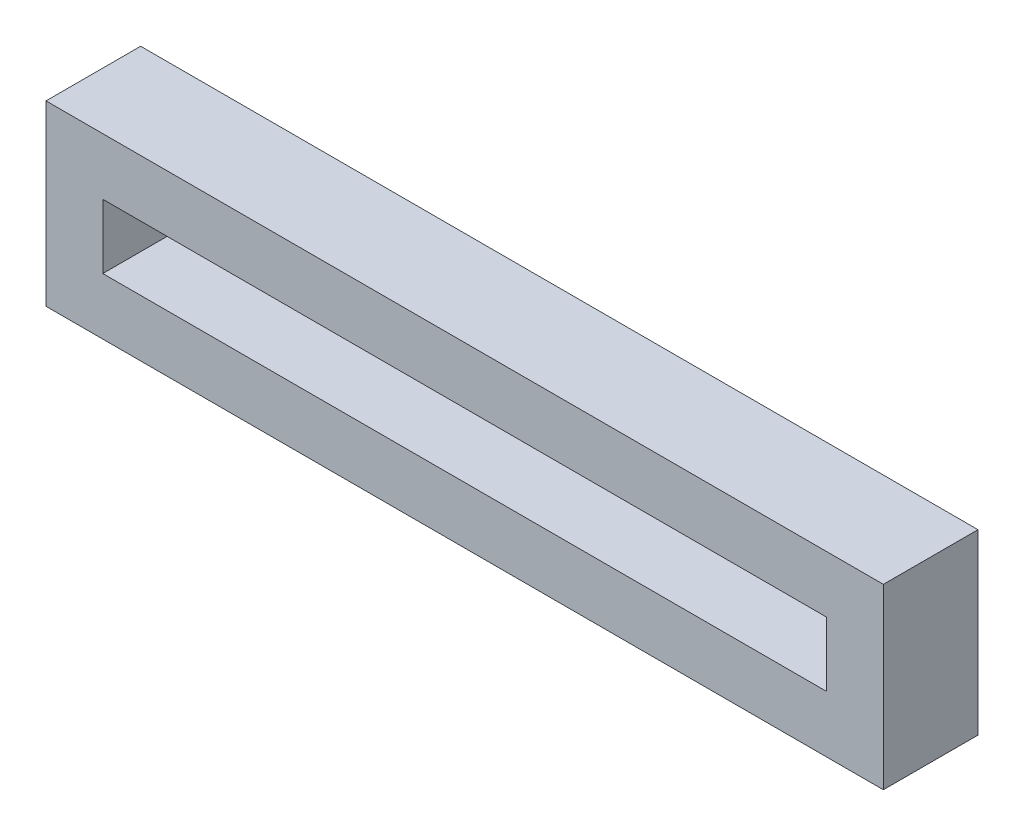
ISO-10303-21;
HEADER;
FILE_DESCRIPTION(('STEP AP214'),'2;1');
FILE_NAME('part.step','',(''),(''),'','','');
FILE_SCHEMA(('AUTOMOTIVE_DESIGN { 1 0 10303 214 1 1 1 1 }'));
ENDSEC;
DATA;
#1=APPLICATION_CONTEXT('core data for automotive mechanical design processes');
#2=APPLICATION_PROTOCOL_DEFINITION('international standard','automotive_design',2000,#1);
#3=PRODUCT_CONTEXT('',#1,'mechanical');
#4=PRODUCT('Part','Part','',(#3));
#5=PRODUCT_RELATED_PRODUCT_CATEGORY('part','',(#4));
#6=PRODUCT_DEFINITION_FORMATION('','',#4);
#7=PRODUCT_DEFINITION_CONTEXT('part definition',#1,'design');
#8=PRODUCT_DEFINITION('design','',#6,#7);
#9=PRODUCT_DEFINITION_SHAPE('','',#8);
#10=(LENGTH_UNIT() NAMED_UNIT(*) SI_UNIT(.MILLI.,.METRE.));
#11=(NAMED_UNIT(*) PLANE_ANGLE_UNIT() SI_UNIT($,.RADIAN.));
#12=(NAMED_UNIT(*) SI_UNIT($,.STERADIAN.) SOLID_ANGLE_UNIT());
#13=UNCERTAINTY_MEASURE_WITH_UNIT(LENGTH_MEASURE(1.E-05),#10,'distance_accuracy_value','');
#14=(GEOMETRIC_REPRESENTATION_CONTEXT(3) GLOBAL_UNCERTAINTY_ASSIGNED_CONTEXT((#13)) GLOBAL_UNIT_ASSIGNED_CONTEXT((#10,
#11,#12)) REPRESENTATION_CONTEXT('',''));
#15=CARTESIAN_POINT('',(0.,0.,0.));
#16=DIRECTION('',(0.,0.,1.));
#17=DIRECTION('',(1.,0.,0.));
#18=AXIS2_PLACEMENT_3D('',#15,#16,#17);
#19=CARTESIAN_POINT('',(0.,0.,6.35));
#20=DIRECTION('',(0.,0.,-1.));
#21=DIRECTION('',(-1.,0.,0.));
#22=AXIS2_PLACEMENT_3D('',#19,#20,#21);
#23=PLANE('',#22);
#24=DIRECTION('',(0.,-1.,0.));
#25=VECTOR('',#24,1.);
#26=CARTESIAN_POINT('',(0.69215000000001,10.972165,6.35));
#27=LINE('',#26,#25);
#28=CARTESIAN_POINT('',(0.69215000000001,22.910165,6.35));
#29=VERTEX_POINT('',#28);
#30=CARTESIAN_POINT('',(0.69215000000001,10.972165,6.35));
#31=VERTEX_POINT('',#30);
#32=EDGE_CURVE('E138',#29,#31,#27,.T.);
#33=ORIENTED_EDGE('',*,*,#32,.T.);
#34=DIRECTION('',(1.,0.,0.));
#35=VECTOR('',#34,1.);
#36=CARTESIAN_POINT('',(0.69215000000001,10.972165,6.35));
#37=LINE('',#36,#35);
#38=CARTESIAN_POINT('',(56.87695,10.972165,6.35));
#39=VERTEX_POINT('',#38);
#40=EDGE_CURVE('E141',#31,#39,#37,.T.);
#41=ORIENTED_EDGE('',*,*,#40,.T.);
#42=DIRECTION('',(0.,1.,0.));
#43=VECTOR('',#42,1.);
#44=CARTESIAN_POINT('',(56.87695,10.972165,6.35));
#45=LINE('',#44,#43);
#46=CARTESIAN_POINT('',(56.87695,22.910165,6.35));
#47=VERTEX_POINT('',#46);
#48=EDGE_CURVE('E144',#39,#47,#45,.T.);
#49=ORIENTED_EDGE('',*,*,#48,.T.);
#50=DIRECTION('',(-1.,0.,0.));
#51=VECTOR('',#50,1.);
#52=CARTESIAN_POINT('',(0.69215000000001,22.910165,6.35));
#53=LINE('',#52,#51);
#54=EDGE_CURVE('E146',#47,#29,#53,.T.);
#55=ORIENTED_EDGE('',*,*,#54,.T.);
#56=EDGE_LOOP('',(#33,#41,#49,#55));
#57=FACE_BOUND('',#56,.T.);
#58=DIRECTION('',(0.,-1.,0.));
#59=VECTOR('',#58,1.);
#60=CARTESIAN_POINT('',(4.50215000000001,14.782165,6.35));
#61=LINE('',#60,#59);
#62=CARTESIAN_POINT('',(4.50215000000001,19.100165,6.35));
#63=VERTEX_POINT('',#62);
#64=CARTESIAN_POINT('',(4.50215000000001,14.782165,6.35));
#65=VERTEX_POINT('',#64);
#66=EDGE_CURVE('E102',#63,#65,#61,.T.);
#67=ORIENTED_EDGE('',*,*,#66,.F.);
#68=DIRECTION('',(-1.,0.,0.));
#69=VECTOR('',#68,1.);
#70=CARTESIAN_POINT('',(4.50215000000001,19.100165,6.35));
#71=LINE('',#70,#69);
#72=CARTESIAN_POINT('',(53.06695,19.100165,6.35));
#73=VERTEX_POINT('',#72);
#74=EDGE_CURVE('E124',#73,#63,#71,.T.);
#75=ORIENTED_EDGE('',*,*,#74,.F.);
#76=DIRECTION('',(0.,1.,0.));
#77=VECTOR('',#76,1.);
#78=CARTESIAN_POINT('',(53.06695,14.782165,6.35));
#79=LINE('',#78,#77);
#80=CARTESIAN_POINT('',(53.06695,14.782165,6.35));
#81=VERTEX_POINT('',#80);
#82=EDGE_CURVE('E122',#81,#73,#79,.T.);
#83=ORIENTED_EDGE('',*,*,#82,.F.);
#84=DIRECTION('',(1.,0.,0.));
#85=VECTOR('',#84,1.);
#86=CARTESIAN_POINT('',(4.50215000000001,14.782165,6.35));
#87=LINE('',#86,#85);
#88=EDGE_CURVE('E110',#65,#81,#87,.T.);
#89=ORIENTED_EDGE('',*,*,#88,.F.);
#90=EDGE_LOOP('',(#67,#75,#83,#89));
#91=FACE_BOUND('',#90,.T.);
#92=ADVANCED_FACE('F37',(#57,#91),#23,.F.);
#93=CARTESIAN_POINT('',(0.,0.,0.));
#94=DIRECTION('',(0.,0.,-1.));
#95=DIRECTION('',(-1.,0.,0.));
#96=AXIS2_PLACEMENT_3D('',#93,#94,#95);
#97=PLANE('',#96);
#98=DIRECTION('',(0.,-1.,0.));
#99=VECTOR('',#98,1.);
#100=CARTESIAN_POINT('',(0.69215000000001,10.972165,0.));
#101=LINE('',#100,#99);
#102=CARTESIAN_POINT('',(0.69215000000001,22.910165,0.));
#103=VERTEX_POINT('',#102);
#104=CARTESIAN_POINT('',(0.69215000000001,10.972165,0.));
#105=VERTEX_POINT('',#104);
#106=EDGE_CURVE('E118',#103,#105,#101,.T.);
#107=ORIENTED_EDGE('',*,*,#106,.F.);
#108=DIRECTION('',(-1.,0.,0.));
#109=VECTOR('',#108,1.);
#110=CARTESIAN_POINT('',(0.69215000000001,22.910165,0.));
#111=LINE('',#110,#109);
#112=CARTESIAN_POINT('',(56.87695,22.910165,0.));
#113=VERTEX_POINT('',#112);
#114=EDGE_CURVE('E142',#113,#103,#111,.T.);
#115=ORIENTED_EDGE('',*,*,#114,.F.);
#116=DIRECTION('',(0.,1.,0.));
#117=VECTOR('',#116,1.);
#118=CARTESIAN_POINT('',(56.87695,10.972165,0.));
#119=LINE('',#118,#117);
#120=CARTESIAN_POINT('',(56.87695,10.972165,0.));
#121=VERTEX_POINT('',#120);
#122=EDGE_CURVE('E153',#121,#113,#119,.T.);
#123=ORIENTED_EDGE('',*,*,#122,.F.);
#124=DIRECTION('',(1.,0.,0.));
#125=VECTOR('',#124,1.);
#126=CARTESIAN_POINT('',(0.69215000000001,10.972165,0.));
#127=LINE('',#126,#125);
#128=EDGE_CURVE('E151',#105,#121,#127,.T.);
#129=ORIENTED_EDGE('',*,*,#128,.F.);
#130=EDGE_LOOP('',(#107,#115,#123,#129));
#131=FACE_BOUND('',#130,.T.);
#132=DIRECTION('',(-1.,0.,0.));
#133=VECTOR('',#132,1.);
#134=CARTESIAN_POINT('',(4.50215000000001,19.100165,0.));
#135=LINE('',#134,#133);
#136=CARTESIAN_POINT('',(53.06695,19.100165,0.));
#137=VERTEX_POINT('',#136);
#138=CARTESIAN_POINT('',(4.50215000000001,19.100165,0.));
#139=VERTEX_POINT('',#138);
#140=EDGE_CURVE('E111',#137,#139,#135,.T.);
#141=ORIENTED_EDGE('',*,*,#140,.T.);
#142=DIRECTION('',(0.,-1.,0.));
#143=VECTOR('',#142,1.);
#144=CARTESIAN_POINT('',(4.50215000000001,14.782165,0.));
#145=LINE('',#144,#143);
#146=CARTESIAN_POINT('',(4.50215000000001,14.782165,0.));
#147=VERTEX_POINT('',#146);
#148=EDGE_CURVE('E60',#139,#147,#145,.T.);
#149=ORIENTED_EDGE('',*,*,#148,.T.);
#150=DIRECTION('',(1.,0.,0.));
#151=VECTOR('',#150,1.);
#152=CARTESIAN_POINT('',(4.50215000000001,14.782165,0.));
#153=LINE('',#152,#151);
#154=CARTESIAN_POINT('',(53.06695,14.782165,0.));
#155=VERTEX_POINT('',#154);
#156=EDGE_CURVE('E117',#147,#155,#153,.T.);
#157=ORIENTED_EDGE('',*,*,#156,.T.);
#158=DIRECTION('',(0.,1.,0.));
#159=VECTOR('',#158,1.);
#160=CARTESIAN_POINT('',(53.06695,14.782165,0.));
#161=LINE('',#160,#159);
#162=EDGE_CURVE('E130',#155,#137,#161,.T.);
#163=ORIENTED_EDGE('',*,*,#162,.T.);
#164=EDGE_LOOP('',(#141,#149,#157,#163));
#165=FACE_BOUND('',#164,.T.);
#166=ADVANCED_FACE('F171',(#131,#165),#97,.T.);
#167=CARTESIAN_POINT('',(0.69215000000001,10.972165,6.35));
#168=DIRECTION('',(1.,0.,0.));
#169=DIRECTION('',(0.,0.,-1.));
#170=AXIS2_PLACEMENT_3D('',#167,#168,#169);
#171=PLANE('',#170);
#172=ORIENTED_EDGE('',*,*,#106,.T.);
#173=DIRECTION('',(0.,0.,-1.));
#174=VECTOR('',#173,1.);
#175=CARTESIAN_POINT('',(0.69215000000001,10.972165,6.35));
#176=LINE('',#175,#174);
#177=EDGE_CURVE('E11',#31,#105,#176,.T.);
#178=ORIENTED_EDGE('',*,*,#177,.F.);
#179=ORIENTED_EDGE('',*,*,#32,.F.);
#180=DIRECTION('',(0.,0.,-1.));
#181=VECTOR('',#180,1.);
#182=CARTESIAN_POINT('',(0.69215000000001,22.910165,6.35));
#183=LINE('',#182,#181);
#184=EDGE_CURVE('E148',#29,#103,#183,.T.);
#185=ORIENTED_EDGE('',*,*,#184,.T.);
#186=EDGE_LOOP('',(#172,#178,#179,#185));
#187=FACE_BOUND('',#186,.T.);
#188=ADVANCED_FACE('F39',(#187),#171,.F.);
#189=CARTESIAN_POINT('',(0.69215000000001,10.972165,6.35));
#190=DIRECTION('',(0.,1.,0.));
#191=DIRECTION('',(0.,0.,1.));
#192=AXIS2_PLACEMENT_3D('',#189,#190,#191);
#193=PLANE('',#192);
#194=ORIENTED_EDGE('',*,*,#128,.T.);
#195=DIRECTION('',(0.,0.,-1.));
#196=VECTOR('',#195,1.);
#197=CARTESIAN_POINT('',(56.87695,10.972165,6.35));
#198=LINE('',#197,#196);
#199=EDGE_CURVE('E45',#39,#121,#198,.T.);
#200=ORIENTED_EDGE('',*,*,#199,.F.);
#201=ORIENTED_EDGE('',*,*,#40,.F.);
#202=ORIENTED_EDGE('',*,*,#177,.T.);
#203=EDGE_LOOP('',(#194,#200,#201,#202));
#204=FACE_BOUND('',#203,.T.);
#205=ADVANCED_FACE('F181',(#204),#193,.F.);
#206=CARTESIAN_POINT('',(56.87695,10.972165,6.35));
#207=DIRECTION('',(-1.,0.,0.));
#208=DIRECTION('',(0.,0.,1.));
#209=AXIS2_PLACEMENT_3D('',#206,#207,#208);
#210=PLANE('',#209);
#211=ORIENTED_EDGE('',*,*,#122,.T.);
#212=DIRECTION('',(0.,0.,-1.));
#213=VECTOR('',#212,1.);
#214=CARTESIAN_POINT('',(56.87695,22.910165,6.35));
#215=LINE('',#214,#213);
#216=EDGE_CURVE('E158',#47,#113,#215,.T.);
#217=ORIENTED_EDGE('',*,*,#216,.F.);
#218=ORIENTED_EDGE('',*,*,#48,.F.);
#219=ORIENTED_EDGE('',*,*,#199,.T.);
#220=EDGE_LOOP('',(#211,#217,#218,#219));
#221=FACE_BOUND('',#220,.T.);
#222=ADVANCED_FACE('F165',(#221),#210,.F.);
#223=CARTESIAN_POINT('',(0.69215000000001,22.910165,6.35));
#224=DIRECTION('',(0.,-1.,0.));
#225=DIRECTION('',(0.,0.,-1.));
#226=AXIS2_PLACEMENT_3D('',#223,#224,#225);
#227=PLANE('',#226);
#228=ORIENTED_EDGE('',*,*,#114,.T.);
#229=ORIENTED_EDGE('',*,*,#184,.F.);
#230=ORIENTED_EDGE('',*,*,#54,.F.);
#231=ORIENTED_EDGE('',*,*,#216,.T.);
#232=EDGE_LOOP('',(#228,#229,#230,#231));
#233=FACE_BOUND('',#232,.T.);
#234=ADVANCED_FACE('F175',(#233),#227,.F.);
#235=CARTESIAN_POINT('',(4.50215000000001,14.782165,6.35));
#236=DIRECTION('',(1.,0.,0.));
#237=DIRECTION('',(0.,0.,-1.));
#238=AXIS2_PLACEMENT_3D('',#235,#236,#237);
#239=PLANE('',#238);
#240=ORIENTED_EDGE('',*,*,#148,.F.);
#241=DIRECTION('',(0.,0.,-1.));
#242=VECTOR('',#241,1.);
#243=CARTESIAN_POINT('',(4.50215000000001,19.100165,6.35));
#244=LINE('',#243,#242);
#245=EDGE_CURVE('E106',#63,#139,#244,.T.);
#246=ORIENTED_EDGE('',*,*,#245,.F.);
#247=ORIENTED_EDGE('',*,*,#66,.T.);
#248=DIRECTION('',(0.,0.,-1.));
#249=VECTOR('',#248,1.);
#250=CARTESIAN_POINT('',(4.50215000000001,14.782165,6.35));
#251=LINE('',#250,#249);
#252=EDGE_CURVE('E105',#65,#147,#251,.T.);
#253=ORIENTED_EDGE('',*,*,#252,.T.);
#254=EDGE_LOOP('',(#240,#246,#247,#253));
#255=FACE_BOUND('',#254,.T.);
#256=ADVANCED_FACE('F104',(#255),#239,.T.);
#257=CARTESIAN_POINT('',(4.50215000000001,14.782165,6.35));
#258=DIRECTION('',(0.,1.,0.));
#259=DIRECTION('',(0.,0.,1.));
#260=AXIS2_PLACEMENT_3D('',#257,#258,#259);
#261=PLANE('',#260);
#262=ORIENTED_EDGE('',*,*,#156,.F.);
#263=ORIENTED_EDGE('',*,*,#252,.F.);
#264=ORIENTED_EDGE('',*,*,#88,.T.);
#265=DIRECTION('',(0.,0.,-1.));
#266=VECTOR('',#265,1.);
#267=CARTESIAN_POINT('',(53.06695,14.782165,6.35));
#268=LINE('',#267,#266);
#269=EDGE_CURVE('E119',#81,#155,#268,.T.);
#270=ORIENTED_EDGE('',*,*,#269,.T.);
#271=EDGE_LOOP('',(#262,#263,#264,#270));
#272=FACE_BOUND('',#271,.T.);
#273=ADVANCED_FACE('F114',(#272),#261,.T.);
#274=CARTESIAN_POINT('',(53.06695,14.782165,6.35));
#275=DIRECTION('',(-1.,0.,0.));
#276=DIRECTION('',(0.,0.,1.));
#277=AXIS2_PLACEMENT_3D('',#274,#275,#276);
#278=PLANE('',#277);
#279=ORIENTED_EDGE('',*,*,#162,.F.);
#280=ORIENTED_EDGE('',*,*,#269,.F.);
#281=ORIENTED_EDGE('',*,*,#82,.T.);
#282=DIRECTION('',(0.,0.,-1.));
#283=VECTOR('',#282,1.);
#284=CARTESIAN_POINT('',(53.06695,19.100165,6.35));
#285=LINE('',#284,#283);
#286=EDGE_CURVE('E52',#73,#137,#285,.T.);
#287=ORIENTED_EDGE('',*,*,#286,.T.);
#288=EDGE_LOOP('',(#279,#280,#281,#287));
#289=FACE_BOUND('',#288,.T.);
#290=ADVANCED_FACE('F204',(#289),#278,.T.);
#291=CARTESIAN_POINT('',(4.50215000000001,19.100165,6.35));
#292=DIRECTION('',(0.,-1.,0.));
#293=DIRECTION('',(0.,0.,-1.));
#294=AXIS2_PLACEMENT_3D('',#291,#292,#293);
#295=PLANE('',#294);
#296=ORIENTED_EDGE('',*,*,#140,.F.);
#297=ORIENTED_EDGE('',*,*,#286,.F.);
#298=ORIENTED_EDGE('',*,*,#74,.T.);
#299=ORIENTED_EDGE('',*,*,#245,.T.);
#300=EDGE_LOOP('',(#296,#297,#298,#299));
#301=FACE_BOUND('',#300,.T.);
#302=ADVANCED_FACE('F208',(#301),#295,.T.);
#303=CLOSED_SHELL('',(#92,#166,#188,#205,#222,#234,#256,#273,#290,#302));
#304=MANIFOLD_SOLID_BREP('B2',#303);
#305=ADVANCED_BREP_SHAPE_REPRESENTATION('',(#18,#304),#14);
#306=SHAPE_DEFINITION_REPRESENTATION(#9,#305);
ENDSEC;
END-ISO-10303-21;
